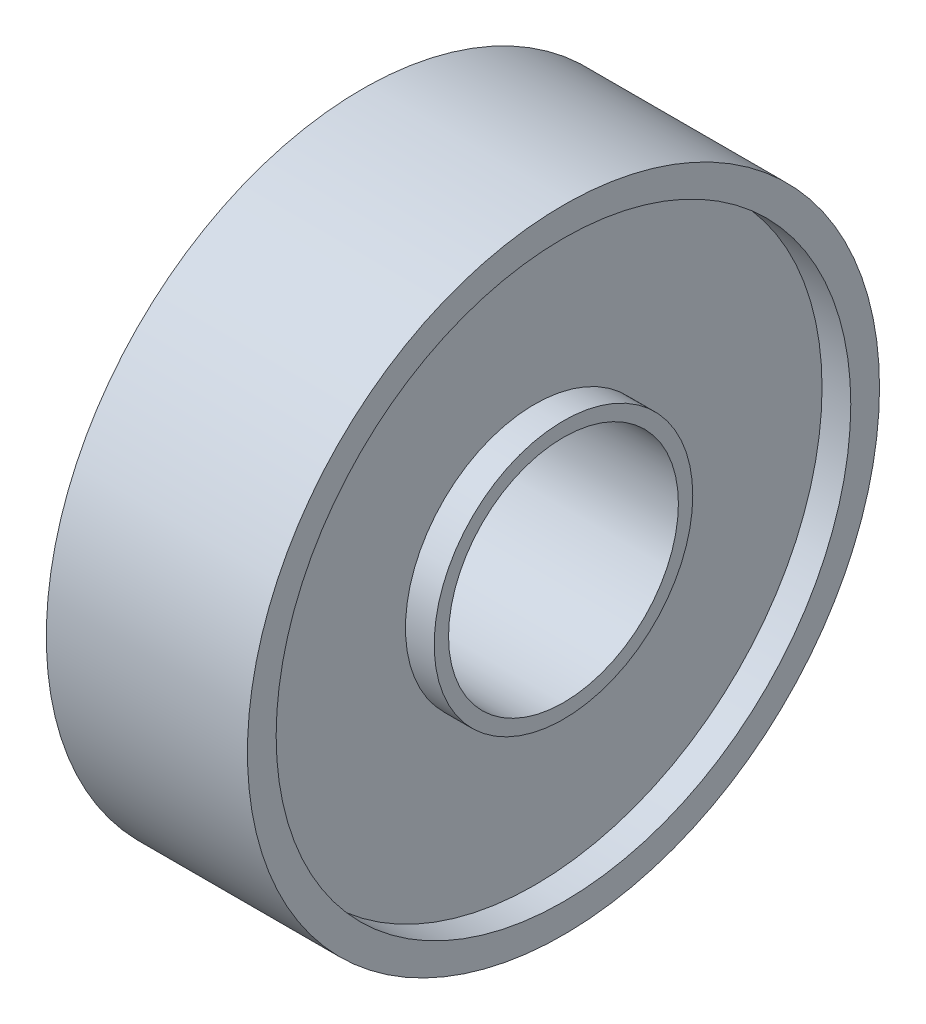
ISO-10303-21;
HEADER;
FILE_DESCRIPTION(('STEP AP214'),'2;1');
FILE_NAME('part.step','',(''),(''),'','','');
FILE_SCHEMA(('AUTOMOTIVE_DESIGN { 1 0 10303 214 1 1 1 1 }'));
ENDSEC;
DATA;
#1=APPLICATION_CONTEXT('core data for automotive mechanical design processes');
#2=APPLICATION_PROTOCOL_DEFINITION('international standard','automotive_design',2000,#1);
#3=PRODUCT_CONTEXT('',#1,'mechanical');
#4=PRODUCT('Part','Part','',(#3));
#5=PRODUCT_RELATED_PRODUCT_CATEGORY('part','',(#4));
#6=PRODUCT_DEFINITION_FORMATION('','',#4);
#7=PRODUCT_DEFINITION_CONTEXT('part definition',#1,'design');
#8=PRODUCT_DEFINITION('design','',#6,#7);
#9=PRODUCT_DEFINITION_SHAPE('','',#8);
#10=(LENGTH_UNIT() NAMED_UNIT(*) SI_UNIT(.MILLI.,.METRE.));
#11=(NAMED_UNIT(*) PLANE_ANGLE_UNIT() SI_UNIT($,.RADIAN.));
#12=(NAMED_UNIT(*) SI_UNIT($,.STERADIAN.) SOLID_ANGLE_UNIT());
#13=UNCERTAINTY_MEASURE_WITH_UNIT(LENGTH_MEASURE(1.E-05),#10,'distance_accuracy_value','');
#14=(GEOMETRIC_REPRESENTATION_CONTEXT(3) GLOBAL_UNCERTAINTY_ASSIGNED_CONTEXT((#13)) GLOBAL_UNIT_ASSIGNED_CONTEXT((#10,
#11,#12)) REPRESENTATION_CONTEXT('',''));
#15=CARTESIAN_POINT('',(0.,0.,0.));
#16=DIRECTION('',(0.,0.,1.));
#17=DIRECTION('',(1.,0.,0.));
#18=AXIS2_PLACEMENT_3D('',#15,#16,#17);
#19=CARTESIAN_POINT('',(0.,0.,0.));
#20=DIRECTION('',(1.,0.,0.));
#21=DIRECTION('',(0.,0.,-1.));
#22=AXIS2_PLACEMENT_3D('',#19,#20,#21);
#23=PLANE('',#22);
#24=CARTESIAN_POINT('',(0.,0.,0.));
#25=DIRECTION('',(1.,0.,0.));
#26=DIRECTION('',(0.,0.,-1.));
#27=AXIS2_PLACEMENT_3D('',#24,#25,#26);
#28=CIRCLE('',#27,4.);
#29=CARTESIAN_POINT('',(0.,0.,-4.));
#30=VERTEX_POINT('',#29);
#31=EDGE_CURVE('E44',#30,#30,#28,.T.);
#32=ORIENTED_EDGE('',*,*,#31,.T.);
#33=EDGE_LOOP('',(#32));
#34=FACE_BOUND('',#33,.T.);
#35=CARTESIAN_POINT('',(0.,0.,0.));
#36=DIRECTION('',(-1.,0.,0.));
#37=DIRECTION('',(0.,0.,1.));
#38=AXIS2_PLACEMENT_3D('',#35,#36,#37);
#39=CIRCLE('',#38,4.5);
#40=CARTESIAN_POINT('',(0.,0.,4.5));
#41=VERTEX_POINT('',#40);
#42=EDGE_CURVE('E68',#41,#41,#39,.T.);
#43=ORIENTED_EDGE('',*,*,#42,.T.);
#44=EDGE_LOOP('',(#43));
#45=FACE_BOUND('',#44,.T.);
#46=ADVANCED_FACE('F31',(#34,#45),#23,.F.);
#47=CARTESIAN_POINT('',(7.,0.,0.));
#48=DIRECTION('',(1.,0.,0.));
#49=DIRECTION('',(0.,0.,-1.));
#50=AXIS2_PLACEMENT_3D('',#47,#48,#49);
#51=PLANE('',#50);
#52=CARTESIAN_POINT('',(7.,0.,0.));
#53=DIRECTION('',(1.,0.,0.));
#54=DIRECTION('',(0.,0.,-1.));
#55=AXIS2_PLACEMENT_3D('',#52,#53,#54);
#56=CIRCLE('',#55,4.);
#57=CARTESIAN_POINT('',(7.,0.,-4.));
#58=VERTEX_POINT('',#57);
#59=EDGE_CURVE('E42',#58,#58,#56,.T.);
#60=ORIENTED_EDGE('',*,*,#59,.F.);
#61=EDGE_LOOP('',(#60));
#62=FACE_BOUND('',#61,.T.);
#63=CARTESIAN_POINT('',(7.,0.,0.));
#64=DIRECTION('',(1.,0.,0.));
#65=DIRECTION('',(0.,0.,-1.));
#66=AXIS2_PLACEMENT_3D('',#63,#64,#65);
#67=CIRCLE('',#66,4.5);
#68=CARTESIAN_POINT('',(7.,0.,-4.5));
#69=VERTEX_POINT('',#68);
#70=EDGE_CURVE('E56',#69,#69,#67,.T.);
#71=ORIENTED_EDGE('',*,*,#70,.T.);
#72=EDGE_LOOP('',(#71));
#73=FACE_BOUND('',#72,.T.);
#74=ADVANCED_FACE('F106',(#62,#73),#51,.T.);
#75=CARTESIAN_POINT('',(7.,0.,0.));
#76=DIRECTION('',(1.,0.,0.));
#77=DIRECTION('',(0.,0.,-1.));
#78=AXIS2_PLACEMENT_3D('',#75,#76,#77);
#79=CIRCLE('',#78,10.);
#80=CARTESIAN_POINT('',(7.,0.,-10.));
#81=VERTEX_POINT('',#80);
#82=EDGE_CURVE('E50',#81,#81,#79,.T.);
#83=ORIENTED_EDGE('',*,*,#82,.F.);
#84=EDGE_LOOP('',(#83));
#85=FACE_BOUND('',#84,.T.);
#86=CARTESIAN_POINT('',(7.,0.,0.));
#87=DIRECTION('',(1.,0.,0.));
#88=DIRECTION('',(0.,0.,-1.));
#89=AXIS2_PLACEMENT_3D('',#86,#87,#88);
#90=CIRCLE('',#89,11.);
#91=CARTESIAN_POINT('',(7.,0.,-11.));
#92=VERTEX_POINT('',#91);
#93=EDGE_CURVE('E10',#92,#92,#90,.T.);
#94=ORIENTED_EDGE('',*,*,#93,.T.);
#95=EDGE_LOOP('',(#94));
#96=FACE_BOUND('',#95,.T.);
#97=ADVANCED_FACE('F93',(#85,#96),#51,.T.);
#98=CARTESIAN_POINT('',(0.,0.,0.));
#99=DIRECTION('',(-1.,0.,0.));
#100=DIRECTION('',(0.,0.,1.));
#101=AXIS2_PLACEMENT_3D('',#98,#99,#100);
#102=CIRCLE('',#101,10.);
#103=CARTESIAN_POINT('',(0.,0.,10.));
#104=VERTEX_POINT('',#103);
#105=EDGE_CURVE('E62',#104,#104,#102,.T.);
#106=ORIENTED_EDGE('',*,*,#105,.F.);
#107=EDGE_LOOP('',(#106));
#108=FACE_BOUND('',#107,.T.);
#109=CARTESIAN_POINT('',(0.,0.,0.));
#110=DIRECTION('',(1.,0.,0.));
#111=DIRECTION('',(0.,0.,-1.));
#112=AXIS2_PLACEMENT_3D('',#109,#110,#111);
#113=CIRCLE('',#112,11.);
#114=CARTESIAN_POINT('',(0.,0.,-11.));
#115=VERTEX_POINT('',#114);
#116=EDGE_CURVE('E35',#115,#115,#113,.T.);
#117=ORIENTED_EDGE('',*,*,#116,.F.);
#118=EDGE_LOOP('',(#117));
#119=FACE_BOUND('',#118,.T.);
#120=ADVANCED_FACE('F90',(#108,#119),#23,.F.);
#121=CARTESIAN_POINT('',(7.,0.,0.));
#122=DIRECTION('',(-1.,0.,0.));
#123=DIRECTION('',(0.,0.,1.));
#124=AXIS2_PLACEMENT_3D('',#121,#122,#123);
#125=CYLINDRICAL_SURFACE('',#124,11.);
#126=ORIENTED_EDGE('',*,*,#93,.F.);
#127=EDGE_LOOP('',(#126));
#128=FACE_BOUND('',#127,.T.);
#129=ORIENTED_EDGE('',*,*,#116,.T.);
#130=EDGE_LOOP('',(#129));
#131=FACE_BOUND('',#130,.T.);
#132=ADVANCED_FACE('F33',(#128,#131),#125,.T.);
#133=CARTESIAN_POINT('',(7.,0.,0.));
#134=DIRECTION('',(-1.,0.,0.));
#135=DIRECTION('',(0.,0.,1.));
#136=AXIS2_PLACEMENT_3D('',#133,#134,#135);
#137=CYLINDRICAL_SURFACE('',#136,4.);
#138=ORIENTED_EDGE('',*,*,#59,.T.);
#139=EDGE_LOOP('',(#138));
#140=FACE_BOUND('',#139,.T.);
#141=ORIENTED_EDGE('',*,*,#31,.F.);
#142=EDGE_LOOP('',(#141));
#143=FACE_BOUND('',#142,.T.);
#144=ADVANCED_FACE('F97',(#140,#143),#137,.F.);
#145=CARTESIAN_POINT('',(6.,0.,0.));
#146=DIRECTION('',(1.,0.,0.));
#147=DIRECTION('',(0.,0.,-1.));
#148=AXIS2_PLACEMENT_3D('',#145,#146,#147);
#149=CYLINDRICAL_SURFACE('',#148,10.);
#150=CARTESIAN_POINT('',(6.,0.,0.));
#151=DIRECTION('',(1.,0.,0.));
#152=DIRECTION('',(0.,0.,-1.));
#153=AXIS2_PLACEMENT_3D('',#150,#151,#152);
#154=CIRCLE('',#153,10.);
#155=CARTESIAN_POINT('',(6.,0.,-10.));
#156=VERTEX_POINT('',#155);
#157=EDGE_CURVE('E47',#156,#156,#154,.T.);
#158=ORIENTED_EDGE('',*,*,#157,.F.);
#159=EDGE_LOOP('',(#158));
#160=FACE_BOUND('',#159,.T.);
#161=ORIENTED_EDGE('',*,*,#82,.T.);
#162=EDGE_LOOP('',(#161));
#163=FACE_BOUND('',#162,.T.);
#164=ADVANCED_FACE('F102',(#160,#163),#149,.F.);
#165=CARTESIAN_POINT('',(6.,0.,0.));
#166=DIRECTION('',(1.,0.,0.));
#167=DIRECTION('',(0.,0.,-1.));
#168=AXIS2_PLACEMENT_3D('',#165,#166,#167);
#169=PLANE('',#168);
#170=CARTESIAN_POINT('',(6.,0.,0.));
#171=DIRECTION('',(1.,0.,0.));
#172=DIRECTION('',(0.,0.,-1.));
#173=AXIS2_PLACEMENT_3D('',#170,#171,#172);
#174=CIRCLE('',#173,4.5);
#175=CARTESIAN_POINT('',(6.,0.,-4.5));
#176=VERTEX_POINT('',#175);
#177=EDGE_CURVE('E53',#176,#176,#174,.T.);
#178=ORIENTED_EDGE('',*,*,#177,.F.);
#179=EDGE_LOOP('',(#178));
#180=FACE_BOUND('',#179,.T.);
#181=ORIENTED_EDGE('',*,*,#157,.T.);
#182=EDGE_LOOP('',(#181));
#183=FACE_BOUND('',#182,.T.);
#184=ADVANCED_FACE('F119',(#180,#183),#169,.T.);
#185=CARTESIAN_POINT('',(6.,0.,0.));
#186=DIRECTION('',(1.,0.,0.));
#187=DIRECTION('',(0.,0.,-1.));
#188=AXIS2_PLACEMENT_3D('',#185,#186,#187);
#189=CYLINDRICAL_SURFACE('',#188,4.5);
#190=ORIENTED_EDGE('',*,*,#177,.T.);
#191=EDGE_LOOP('',(#190));
#192=FACE_BOUND('',#191,.T.);
#193=ORIENTED_EDGE('',*,*,#70,.F.);
#194=EDGE_LOOP('',(#193));
#195=FACE_BOUND('',#194,.T.);
#196=ADVANCED_FACE('F86',(#192,#195),#189,.T.);
#197=CARTESIAN_POINT('',(1.,0.,0.));
#198=DIRECTION('',(-1.,0.,0.));
#199=DIRECTION('',(0.,0.,1.));
#200=AXIS2_PLACEMENT_3D('',#197,#198,#199);
#201=CYLINDRICAL_SURFACE('',#200,10.);
#202=CARTESIAN_POINT('',(1.,0.,0.));
#203=DIRECTION('',(-1.,0.,0.));
#204=DIRECTION('',(0.,0.,1.));
#205=AXIS2_PLACEMENT_3D('',#202,#203,#204);
#206=CIRCLE('',#205,10.);
#207=CARTESIAN_POINT('',(1.,0.,10.));
#208=VERTEX_POINT('',#207);
#209=EDGE_CURVE('E59',#208,#208,#206,.T.);
#210=ORIENTED_EDGE('',*,*,#209,.F.);
#211=EDGE_LOOP('',(#210));
#212=FACE_BOUND('',#211,.T.);
#213=ORIENTED_EDGE('',*,*,#105,.T.);
#214=EDGE_LOOP('',(#213));
#215=FACE_BOUND('',#214,.T.);
#216=ADVANCED_FACE('F80',(#212,#215),#201,.F.);
#217=CARTESIAN_POINT('',(1.,0.,0.));
#218=DIRECTION('',(-1.,0.,0.));
#219=DIRECTION('',(0.,0.,1.));
#220=AXIS2_PLACEMENT_3D('',#217,#218,#219);
#221=PLANE('',#220);
#222=CARTESIAN_POINT('',(1.,0.,0.));
#223=DIRECTION('',(-1.,0.,0.));
#224=DIRECTION('',(0.,0.,1.));
#225=AXIS2_PLACEMENT_3D('',#222,#223,#224);
#226=CIRCLE('',#225,4.5);
#227=CARTESIAN_POINT('',(1.,0.,4.5));
#228=VERTEX_POINT('',#227);
#229=EDGE_CURVE('E65',#228,#228,#226,.T.);
#230=ORIENTED_EDGE('',*,*,#229,.F.);
#231=EDGE_LOOP('',(#230));
#232=FACE_BOUND('',#231,.T.);
#233=ORIENTED_EDGE('',*,*,#209,.T.);
#234=EDGE_LOOP('',(#233));
#235=FACE_BOUND('',#234,.T.);
#236=ADVANCED_FACE('F77',(#232,#235),#221,.T.);
#237=CARTESIAN_POINT('',(1.,0.,0.));
#238=DIRECTION('',(-1.,0.,0.));
#239=DIRECTION('',(0.,0.,1.));
#240=AXIS2_PLACEMENT_3D('',#237,#238,#239);
#241=CYLINDRICAL_SURFACE('',#240,4.5);
#242=ORIENTED_EDGE('',*,*,#229,.T.);
#243=EDGE_LOOP('',(#242));
#244=FACE_BOUND('',#243,.T.);
#245=ORIENTED_EDGE('',*,*,#42,.F.);
#246=EDGE_LOOP('',(#245));
#247=FACE_BOUND('',#246,.T.);
#248=ADVANCED_FACE('F74',(#244,#247),#241,.T.);
#249=CLOSED_SHELL('',(#46,#74,#97,#120,#132,#144,#164,#184,#196,#216,#236,#248));
#250=MANIFOLD_SOLID_BREP('B2',#249);
#251=ADVANCED_BREP_SHAPE_REPRESENTATION('',(#18,#250),#14);
#252=SHAPE_DEFINITION_REPRESENTATION(#9,#251);
ENDSEC;
END-ISO-10303-21;
